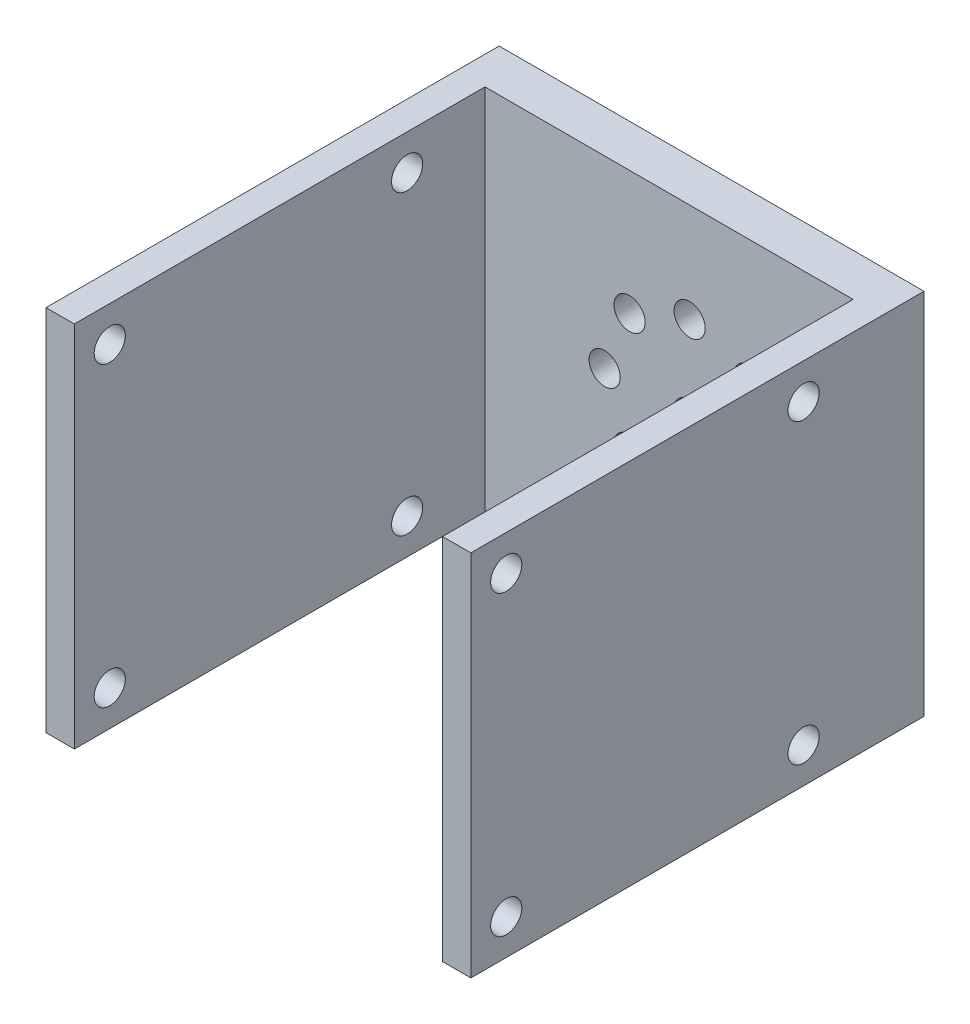
ISO-10303-21;
HEADER;
FILE_DESCRIPTION(('STEP AP214'),'2;1');
FILE_NAME('part.step','',(''),(''),'','','');
FILE_SCHEMA(('AUTOMOTIVE_DESIGN { 1 0 10303 214 1 1 1 1 }'));
ENDSEC;
DATA;
#1=APPLICATION_CONTEXT('core data for automotive mechanical design processes');
#2=APPLICATION_PROTOCOL_DEFINITION('international standard','automotive_design',2000,#1);
#3=PRODUCT_CONTEXT('',#1,'mechanical');
#4=PRODUCT('Part','Part','',(#3));
#5=PRODUCT_RELATED_PRODUCT_CATEGORY('part','',(#4));
#6=PRODUCT_DEFINITION_FORMATION('','',#4);
#7=PRODUCT_DEFINITION_CONTEXT('part definition',#1,'design');
#8=PRODUCT_DEFINITION('design','',#6,#7);
#9=PRODUCT_DEFINITION_SHAPE('','',#8);
#10=(LENGTH_UNIT() NAMED_UNIT(*) SI_UNIT(.MILLI.,.METRE.));
#11=(NAMED_UNIT(*) PLANE_ANGLE_UNIT() SI_UNIT($,.RADIAN.));
#12=(NAMED_UNIT(*) SI_UNIT($,.STERADIAN.) SOLID_ANGLE_UNIT());
#13=UNCERTAINTY_MEASURE_WITH_UNIT(LENGTH_MEASURE(1.E-05),#10,'distance_accuracy_value','');
#14=(GEOMETRIC_REPRESENTATION_CONTEXT(3) GLOBAL_UNCERTAINTY_ASSIGNED_CONTEXT((#13)) GLOBAL_UNIT_ASSIGNED_CONTEXT((#10,
#11,#12)) REPRESENTATION_CONTEXT('',''));
#15=CARTESIAN_POINT('',(0.,0.,0.));
#16=DIRECTION('',(0.,0.,1.));
#17=DIRECTION('',(1.,0.,0.));
#18=AXIS2_PLACEMENT_3D('',#15,#16,#17);
#19=CARTESIAN_POINT('',(0.,0.,3.));
#20=DIRECTION('',(0.,0.,1.));
#21=DIRECTION('',(1.,0.,0.));
#22=AXIS2_PLACEMENT_3D('',#19,#20,#21);
#23=PLANE('',#22);
#24=CARTESIAN_POINT('',(-4.55,0.,3.));
#25=DIRECTION('',(0.,0.,1.));
#26=DIRECTION('',(1.,0.,0.));
#27=AXIS2_PLACEMENT_3D('',#24,#25,#26);
#28=CIRCLE('',#27,1.1);
#29=CARTESIAN_POINT('',(-3.45,0.,3.));
#30=VERTEX_POINT('',#29);
#31=EDGE_CURVE('E179',#30,#30,#28,.T.);
#32=ORIENTED_EDGE('',*,*,#31,.F.);
#33=EDGE_LOOP('',(#32));
#34=FACE_BOUND('',#33,.T.);
#35=CARTESIAN_POINT('',(1.45,-6.,3.));
#36=DIRECTION('',(0.,0.,1.));
#37=DIRECTION('',(1.,0.,0.));
#38=AXIS2_PLACEMENT_3D('',#35,#36,#37);
#39=CIRCLE('',#38,1.1);
#40=CARTESIAN_POINT('',(2.55,-6.,3.));
#41=VERTEX_POINT('',#40);
#42=EDGE_CURVE('E191',#41,#41,#39,.T.);
#43=ORIENTED_EDGE('',*,*,#42,.F.);
#44=EDGE_LOOP('',(#43));
#45=FACE_BOUND('',#44,.T.);
#46=CARTESIAN_POINT('',(7.45,0.,3.));
#47=DIRECTION('',(0.,0.,1.));
#48=DIRECTION('',(1.,0.,0.));
#49=AXIS2_PLACEMENT_3D('',#46,#47,#48);
#50=CIRCLE('',#49,1.1);
#51=CARTESIAN_POINT('',(8.55,0.,3.));
#52=VERTEX_POINT('',#51);
#53=EDGE_CURVE('E203',#52,#52,#50,.T.);
#54=ORIENTED_EDGE('',*,*,#53,.F.);
#55=EDGE_LOOP('',(#54));
#56=FACE_BOUND('',#55,.T.);
#57=CARTESIAN_POINT('',(1.45,6.,3.));
#58=DIRECTION('',(0.,0.,1.));
#59=DIRECTION('',(1.,0.,0.));
#60=AXIS2_PLACEMENT_3D('',#57,#58,#59);
#61=CIRCLE('',#60,1.1);
#62=CARTESIAN_POINT('',(2.55,6.,3.));
#63=VERTEX_POINT('',#62);
#64=EDGE_CURVE('E215',#63,#63,#61,.T.);
#65=ORIENTED_EDGE('',*,*,#64,.F.);
#66=EDGE_LOOP('',(#65));
#67=FACE_BOUND('',#66,.T.);
#68=DIRECTION('',(0.,1.,0.));
#69=VECTOR('',#68,1.);
#70=CARTESIAN_POINT('',(13.,13.,3.));
#71=LINE('',#70,#69);
#72=CARTESIAN_POINT('',(13.,-13.,3.));
#73=VERTEX_POINT('',#72);
#74=CARTESIAN_POINT('',(13.,13.,3.));
#75=VERTEX_POINT('',#74);
#76=EDGE_CURVE('E227',#73,#75,#71,.T.);
#77=ORIENTED_EDGE('',*,*,#76,.T.);
#78=DIRECTION('',(-1.,0.,0.));
#79=VECTOR('',#78,1.);
#80=CARTESIAN_POINT('',(-13.,13.,3.));
#81=LINE('',#80,#79);
#82=CARTESIAN_POINT('',(-13.,13.,3.));
#83=VERTEX_POINT('',#82);
#84=EDGE_CURVE('E230',#75,#83,#81,.T.);
#85=ORIENTED_EDGE('',*,*,#84,.T.);
#86=DIRECTION('',(0.,-1.,0.));
#87=VECTOR('',#86,1.);
#88=CARTESIAN_POINT('',(-13.,13.,3.));
#89=LINE('',#88,#87);
#90=CARTESIAN_POINT('',(-13.,-13.,3.));
#91=VERTEX_POINT('',#90);
#92=EDGE_CURVE('E42',#83,#91,#89,.T.);
#93=ORIENTED_EDGE('',*,*,#92,.T.);
#94=DIRECTION('',(1.,0.,0.));
#95=VECTOR('',#94,1.);
#96=CARTESIAN_POINT('',(-13.,-13.,3.));
#97=LINE('',#96,#95);
#98=EDGE_CURVE('E11',#91,#73,#97,.T.);
#99=ORIENTED_EDGE('',*,*,#98,.T.);
#100=EDGE_LOOP('',(#77,#85,#93,#99));
#101=FACE_BOUND('',#100,.T.);
#102=CARTESIAN_POINT('',(1.45,0.,3.));
#103=DIRECTION('',(0.,0.,1.));
#104=DIRECTION('',(1.,0.,0.));
#105=AXIS2_PLACEMENT_3D('',#102,#103,#104);
#106=CIRCLE('',#105,1.1);
#107=CARTESIAN_POINT('',(2.55,0.,3.));
#108=VERTEX_POINT('',#107);
#109=EDGE_CURVE('E221',#108,#108,#106,.T.);
#110=ORIENTED_EDGE('',*,*,#109,.F.);
#111=EDGE_LOOP('',(#110));
#112=FACE_BOUND('',#111,.T.);
#113=CARTESIAN_POINT('',(5.69264068711928,4.24264068711929,3.));
#114=DIRECTION('',(0.,0.,1.));
#115=DIRECTION('',(1.,0.,0.));
#116=AXIS2_PLACEMENT_3D('',#113,#114,#115);
#117=CIRCLE('',#116,1.1);
#118=CARTESIAN_POINT('',(6.79264068711929,4.24264068711929,3.));
#119=VERTEX_POINT('',#118);
#120=EDGE_CURVE('E209',#119,#119,#117,.T.);
#121=ORIENTED_EDGE('',*,*,#120,.F.);
#122=EDGE_LOOP('',(#121));
#123=FACE_BOUND('',#122,.T.);
#124=CARTESIAN_POINT('',(5.69264068711928,-4.24264068711928,3.));
#125=DIRECTION('',(0.,0.,1.));
#126=DIRECTION('',(1.,0.,0.));
#127=AXIS2_PLACEMENT_3D('',#124,#125,#126);
#128=CIRCLE('',#127,1.1);
#129=CARTESIAN_POINT('',(6.79264068711929,-4.24264068711928,3.));
#130=VERTEX_POINT('',#129);
#131=EDGE_CURVE('E197',#130,#130,#128,.T.);
#132=ORIENTED_EDGE('',*,*,#131,.F.);
#133=EDGE_LOOP('',(#132));
#134=FACE_BOUND('',#133,.T.);
#135=CARTESIAN_POINT('',(-2.79264068711929,-4.24264068711929,3.));
#136=DIRECTION('',(0.,0.,1.));
#137=DIRECTION('',(1.,0.,0.));
#138=AXIS2_PLACEMENT_3D('',#135,#136,#137);
#139=CIRCLE('',#138,1.1);
#140=CARTESIAN_POINT('',(-1.69264068711929,-4.24264068711929,3.));
#141=VERTEX_POINT('',#140);
#142=EDGE_CURVE('E185',#141,#141,#139,.T.);
#143=ORIENTED_EDGE('',*,*,#142,.F.);
#144=EDGE_LOOP('',(#143));
#145=FACE_BOUND('',#144,.T.);
#146=CARTESIAN_POINT('',(-2.79264068711929,4.24264068711928,3.));
#147=DIRECTION('',(0.,0.,1.));
#148=DIRECTION('',(1.,0.,0.));
#149=AXIS2_PLACEMENT_3D('',#146,#147,#148);
#150=CIRCLE('',#149,1.1);
#151=CARTESIAN_POINT('',(-1.69264068711929,4.24264068711928,3.));
#152=VERTEX_POINT('',#151);
#153=EDGE_CURVE('E173',#152,#152,#150,.T.);
#154=ORIENTED_EDGE('',*,*,#153,.F.);
#155=EDGE_LOOP('',(#154));
#156=FACE_BOUND('',#155,.T.);
#157=ADVANCED_FACE('F33',(#34,#45,#56,#67,#101,#112,#123,#134,#145,#156),#23,.T.);
#158=CARTESIAN_POINT('',(0.,0.,0.));
#159=DIRECTION('',(0.,0.,1.));
#160=DIRECTION('',(1.,0.,0.));
#161=AXIS2_PLACEMENT_3D('',#158,#159,#160);
#162=PLANE('',#161);
#163=DIRECTION('',(-1.,0.,0.));
#164=VECTOR('',#163,1.);
#165=CARTESIAN_POINT('',(-13.,13.,0.));
#166=LINE('',#165,#164);
#167=CARTESIAN_POINT('',(15.,13.,0.));
#168=VERTEX_POINT('',#167);
#169=CARTESIAN_POINT('',(-15.,13.,0.));
#170=VERTEX_POINT('',#169);
#171=EDGE_CURVE('E224',#168,#170,#166,.T.);
#172=ORIENTED_EDGE('',*,*,#171,.F.);
#173=DIRECTION('',(0.,1.,0.));
#174=VECTOR('',#173,1.);
#175=CARTESIAN_POINT('',(15.,-13.,0.));
#176=LINE('',#175,#174);
#177=CARTESIAN_POINT('',(15.,-13.,0.));
#178=VERTEX_POINT('',#177);
#179=EDGE_CURVE('E118',#178,#168,#176,.T.);
#180=ORIENTED_EDGE('',*,*,#179,.F.);
#181=DIRECTION('',(1.,0.,0.));
#182=VECTOR('',#181,1.);
#183=CARTESIAN_POINT('',(-13.,-13.,0.));
#184=LINE('',#183,#182);
#185=CARTESIAN_POINT('',(-15.,-13.,0.));
#186=VERTEX_POINT('',#185);
#187=EDGE_CURVE('E37',#186,#178,#184,.T.);
#188=ORIENTED_EDGE('',*,*,#187,.F.);
#189=DIRECTION('',(0.,-1.,0.));
#190=VECTOR('',#189,1.);
#191=CARTESIAN_POINT('',(-15.,13.,0.));
#192=LINE('',#191,#190);
#193=EDGE_CURVE('E150',#170,#186,#192,.T.);
#194=ORIENTED_EDGE('',*,*,#193,.F.);
#195=EDGE_LOOP('',(#172,#180,#188,#194));
#196=FACE_BOUND('',#195,.T.);
#197=CARTESIAN_POINT('',(1.45,0.,0.));
#198=DIRECTION('',(0.,0.,1.));
#199=DIRECTION('',(1.,0.,0.));
#200=AXIS2_PLACEMENT_3D('',#197,#198,#199);
#201=CIRCLE('',#200,1.1);
#202=CARTESIAN_POINT('',(2.55,0.,0.));
#203=VERTEX_POINT('',#202);
#204=EDGE_CURVE('E218',#203,#203,#201,.T.);
#205=ORIENTED_EDGE('',*,*,#204,.T.);
#206=EDGE_LOOP('',(#205));
#207=FACE_BOUND('',#206,.T.);
#208=CARTESIAN_POINT('',(1.45,6.,0.));
#209=DIRECTION('',(0.,0.,1.));
#210=DIRECTION('',(1.,0.,0.));
#211=AXIS2_PLACEMENT_3D('',#208,#209,#210);
#212=CIRCLE('',#211,1.1);
#213=CARTESIAN_POINT('',(2.55,6.,0.));
#214=VERTEX_POINT('',#213);
#215=EDGE_CURVE('E212',#214,#214,#212,.T.);
#216=ORIENTED_EDGE('',*,*,#215,.T.);
#217=EDGE_LOOP('',(#216));
#218=FACE_BOUND('',#217,.T.);
#219=CARTESIAN_POINT('',(5.69264068711928,4.24264068711929,0.));
#220=DIRECTION('',(0.,0.,1.));
#221=DIRECTION('',(1.,0.,0.));
#222=AXIS2_PLACEMENT_3D('',#219,#220,#221);
#223=CIRCLE('',#222,1.1);
#224=CARTESIAN_POINT('',(6.79264068711929,4.24264068711929,0.));
#225=VERTEX_POINT('',#224);
#226=EDGE_CURVE('E206',#225,#225,#223,.T.);
#227=ORIENTED_EDGE('',*,*,#226,.T.);
#228=EDGE_LOOP('',(#227));
#229=FACE_BOUND('',#228,.T.);
#230=CARTESIAN_POINT('',(7.45,0.,0.));
#231=DIRECTION('',(0.,0.,1.));
#232=DIRECTION('',(1.,0.,0.));
#233=AXIS2_PLACEMENT_3D('',#230,#231,#232);
#234=CIRCLE('',#233,1.1);
#235=CARTESIAN_POINT('',(8.55,0.,0.));
#236=VERTEX_POINT('',#235);
#237=EDGE_CURVE('E200',#236,#236,#234,.T.);
#238=ORIENTED_EDGE('',*,*,#237,.T.);
#239=EDGE_LOOP('',(#238));
#240=FACE_BOUND('',#239,.T.);
#241=CARTESIAN_POINT('',(5.69264068711928,-4.24264068711928,0.));
#242=DIRECTION('',(0.,0.,1.));
#243=DIRECTION('',(1.,0.,0.));
#244=AXIS2_PLACEMENT_3D('',#241,#242,#243);
#245=CIRCLE('',#244,1.1);
#246=CARTESIAN_POINT('',(6.79264068711929,-4.24264068711928,0.));
#247=VERTEX_POINT('',#246);
#248=EDGE_CURVE('E194',#247,#247,#245,.T.);
#249=ORIENTED_EDGE('',*,*,#248,.T.);
#250=EDGE_LOOP('',(#249));
#251=FACE_BOUND('',#250,.T.);
#252=CARTESIAN_POINT('',(1.45,-6.,0.));
#253=DIRECTION('',(0.,0.,1.));
#254=DIRECTION('',(1.,0.,0.));
#255=AXIS2_PLACEMENT_3D('',#252,#253,#254);
#256=CIRCLE('',#255,1.1);
#257=CARTESIAN_POINT('',(2.55,-6.,0.));
#258=VERTEX_POINT('',#257);
#259=EDGE_CURVE('E188',#258,#258,#256,.T.);
#260=ORIENTED_EDGE('',*,*,#259,.T.);
#261=EDGE_LOOP('',(#260));
#262=FACE_BOUND('',#261,.T.);
#263=CARTESIAN_POINT('',(-2.79264068711929,-4.24264068711929,0.));
#264=DIRECTION('',(0.,0.,1.));
#265=DIRECTION('',(1.,0.,0.));
#266=AXIS2_PLACEMENT_3D('',#263,#264,#265);
#267=CIRCLE('',#266,1.1);
#268=CARTESIAN_POINT('',(-1.69264068711929,-4.24264068711929,0.));
#269=VERTEX_POINT('',#268);
#270=EDGE_CURVE('E182',#269,#269,#267,.T.);
#271=ORIENTED_EDGE('',*,*,#270,.T.);
#272=EDGE_LOOP('',(#271));
#273=FACE_BOUND('',#272,.T.);
#274=CARTESIAN_POINT('',(-4.55,0.,0.));
#275=DIRECTION('',(0.,0.,1.));
#276=DIRECTION('',(1.,0.,0.));
#277=AXIS2_PLACEMENT_3D('',#274,#275,#276);
#278=CIRCLE('',#277,1.1);
#279=CARTESIAN_POINT('',(-3.45,0.,0.));
#280=VERTEX_POINT('',#279);
#281=EDGE_CURVE('E176',#280,#280,#278,.T.);
#282=ORIENTED_EDGE('',*,*,#281,.T.);
#283=EDGE_LOOP('',(#282));
#284=FACE_BOUND('',#283,.T.);
#285=CARTESIAN_POINT('',(-2.79264068711929,4.24264068711928,0.));
#286=DIRECTION('',(0.,0.,1.));
#287=DIRECTION('',(1.,0.,0.));
#288=AXIS2_PLACEMENT_3D('',#285,#286,#287);
#289=CIRCLE('',#288,1.1);
#290=CARTESIAN_POINT('',(-1.69264068711929,4.24264068711928,0.));
#291=VERTEX_POINT('',#290);
#292=EDGE_CURVE('E172',#291,#291,#289,.T.);
#293=ORIENTED_EDGE('',*,*,#292,.T.);
#294=EDGE_LOOP('',(#293));
#295=FACE_BOUND('',#294,.T.);
#296=ADVANCED_FACE('F241',(#196,#207,#218,#229,#240,#251,#262,#273,#284,#295),#162,.F.);
#297=CARTESIAN_POINT('',(-13.,13.,3.));
#298=DIRECTION('',(0.,-1.,0.));
#299=DIRECTION('',(0.,0.,-1.));
#300=AXIS2_PLACEMENT_3D('',#297,#298,#299);
#301=PLANE('',#300);
#302=ORIENTED_EDGE('',*,*,#171,.T.);
#303=DIRECTION('',(0.,0.,-1.));
#304=VECTOR('',#303,1.);
#305=CARTESIAN_POINT('',(-15.,13.,0.));
#306=LINE('',#305,#304);
#307=CARTESIAN_POINT('',(-15.,13.,32.));
#308=VERTEX_POINT('',#307);
#309=EDGE_CURVE('E158',#308,#170,#306,.T.);
#310=ORIENTED_EDGE('',*,*,#309,.F.);
#311=DIRECTION('',(1.,0.,0.));
#312=VECTOR('',#311,1.);
#313=CARTESIAN_POINT('',(-15.,13.,32.));
#314=LINE('',#313,#312);
#315=CARTESIAN_POINT('',(-13.,13.,32.));
#316=VERTEX_POINT('',#315);
#317=EDGE_CURVE('E161',#308,#316,#314,.T.);
#318=ORIENTED_EDGE('',*,*,#317,.T.);
#319=DIRECTION('',(0.,0.,-1.));
#320=VECTOR('',#319,1.);
#321=CARTESIAN_POINT('',(-13.,13.,0.));
#322=LINE('',#321,#320);
#323=EDGE_CURVE('E154',#316,#83,#322,.T.);
#324=ORIENTED_EDGE('',*,*,#323,.T.);
#325=ORIENTED_EDGE('',*,*,#84,.F.);
#326=DIRECTION('',(0.,0.,1.));
#327=VECTOR('',#326,1.);
#328=CARTESIAN_POINT('',(13.,13.,0.));
#329=LINE('',#328,#327);
#330=CARTESIAN_POINT('',(13.,13.,32.));
#331=VERTEX_POINT('',#330);
#332=EDGE_CURVE('E58',#75,#331,#329,.T.);
#333=ORIENTED_EDGE('',*,*,#332,.T.);
#334=DIRECTION('',(-1.,0.,0.));
#335=VECTOR('',#334,1.);
#336=CARTESIAN_POINT('',(15.,13.,32.));
#337=LINE('',#336,#335);
#338=CARTESIAN_POINT('',(15.,13.,32.));
#339=VERTEX_POINT('',#338);
#340=EDGE_CURVE('E104',#339,#331,#337,.T.);
#341=ORIENTED_EDGE('',*,*,#340,.F.);
#342=DIRECTION('',(0.,0.,1.));
#343=VECTOR('',#342,1.);
#344=CARTESIAN_POINT('',(15.,13.,0.));
#345=LINE('',#344,#343);
#346=EDGE_CURVE('E111',#168,#339,#345,.T.);
#347=ORIENTED_EDGE('',*,*,#346,.F.);
#348=EDGE_LOOP('',(#302,#310,#318,#324,#325,#333,#341,#347));
#349=FACE_BOUND('',#348,.T.);
#350=ADVANCED_FACE('F35',(#349),#301,.F.);
#351=CARTESIAN_POINT('',(-13.,-13.,3.));
#352=DIRECTION('',(0.,1.,0.));
#353=DIRECTION('',(0.,0.,1.));
#354=AXIS2_PLACEMENT_3D('',#351,#352,#353);
#355=PLANE('',#354);
#356=ORIENTED_EDGE('',*,*,#187,.T.);
#357=DIRECTION('',(0.,0.,-1.));
#358=VECTOR('',#357,1.);
#359=CARTESIAN_POINT('',(15.,-13.,32.));
#360=LINE('',#359,#358);
#361=CARTESIAN_POINT('',(15.,-13.,32.));
#362=VERTEX_POINT('',#361);
#363=EDGE_CURVE('E110',#362,#178,#360,.T.);
#364=ORIENTED_EDGE('',*,*,#363,.F.);
#365=DIRECTION('',(-1.,0.,0.));
#366=VECTOR('',#365,1.);
#367=CARTESIAN_POINT('',(15.,-13.,32.));
#368=LINE('',#367,#366);
#369=CARTESIAN_POINT('',(13.,-13.,32.));
#370=VERTEX_POINT('',#369);
#371=EDGE_CURVE('E106',#362,#370,#368,.T.);
#372=ORIENTED_EDGE('',*,*,#371,.T.);
#373=DIRECTION('',(0.,0.,-1.));
#374=VECTOR('',#373,1.);
#375=CARTESIAN_POINT('',(13.,-13.,32.));
#376=LINE('',#375,#374);
#377=EDGE_CURVE('E120',#370,#73,#376,.T.);
#378=ORIENTED_EDGE('',*,*,#377,.T.);
#379=ORIENTED_EDGE('',*,*,#98,.F.);
#380=DIRECTION('',(0.,0.,1.));
#381=VECTOR('',#380,1.);
#382=CARTESIAN_POINT('',(-13.,-13.,0.));
#383=LINE('',#382,#381);
#384=CARTESIAN_POINT('',(-13.,-13.,32.));
#385=VERTEX_POINT('',#384);
#386=EDGE_CURVE('E50',#91,#385,#383,.T.);
#387=ORIENTED_EDGE('',*,*,#386,.T.);
#388=DIRECTION('',(1.,0.,0.));
#389=VECTOR('',#388,1.);
#390=CARTESIAN_POINT('',(-15.,-13.,32.));
#391=LINE('',#390,#389);
#392=CARTESIAN_POINT('',(-15.,-13.,32.));
#393=VERTEX_POINT('',#392);
#394=EDGE_CURVE('E169',#393,#385,#391,.T.);
#395=ORIENTED_EDGE('',*,*,#394,.F.);
#396=DIRECTION('',(0.,0.,1.));
#397=VECTOR('',#396,1.);
#398=CARTESIAN_POINT('',(-15.,-13.,0.));
#399=LINE('',#398,#397);
#400=EDGE_CURVE('E153',#186,#393,#399,.T.);
#401=ORIENTED_EDGE('',*,*,#400,.F.);
#402=EDGE_LOOP('',(#356,#364,#372,#378,#379,#387,#395,#401));
#403=FACE_BOUND('',#402,.T.);
#404=ADVANCED_FACE('F236',(#403),#355,.F.);
#405=CARTESIAN_POINT('',(1.45,0.,3.));
#406=DIRECTION('',(0.,0.,-1.));
#407=DIRECTION('',(-1.,0.,0.));
#408=AXIS2_PLACEMENT_3D('',#405,#406,#407);
#409=CYLINDRICAL_SURFACE('',#408,1.1);
#410=ORIENTED_EDGE('',*,*,#109,.T.);
#411=EDGE_LOOP('',(#410));
#412=FACE_BOUND('',#411,.T.);
#413=ORIENTED_EDGE('',*,*,#204,.F.);
#414=EDGE_LOOP('',(#413));
#415=FACE_BOUND('',#414,.T.);
#416=ADVANCED_FACE('F295',(#412,#415),#409,.F.);
#417=CARTESIAN_POINT('',(1.45,6.,3.));
#418=DIRECTION('',(0.,0.,-1.));
#419=DIRECTION('',(-1.,0.,0.));
#420=AXIS2_PLACEMENT_3D('',#417,#418,#419);
#421=CYLINDRICAL_SURFACE('',#420,1.1);
#422=ORIENTED_EDGE('',*,*,#64,.T.);
#423=EDGE_LOOP('',(#422));
#424=FACE_BOUND('',#423,.T.);
#425=ORIENTED_EDGE('',*,*,#215,.F.);
#426=EDGE_LOOP('',(#425));
#427=FACE_BOUND('',#426,.T.);
#428=ADVANCED_FACE('F302',(#424,#427),#421,.F.);
#429=CARTESIAN_POINT('',(5.69264068711928,4.24264068711929,3.));
#430=DIRECTION('',(0.,0.,-1.));
#431=DIRECTION('',(-1.,0.,0.));
#432=AXIS2_PLACEMENT_3D('',#429,#430,#431);
#433=CYLINDRICAL_SURFACE('',#432,1.1);
#434=ORIENTED_EDGE('',*,*,#120,.T.);
#435=EDGE_LOOP('',(#434));
#436=FACE_BOUND('',#435,.T.);
#437=ORIENTED_EDGE('',*,*,#226,.F.);
#438=EDGE_LOOP('',(#437));
#439=FACE_BOUND('',#438,.T.);
#440=ADVANCED_FACE('F427',(#436,#439),#433,.F.);
#441=CARTESIAN_POINT('',(7.45,0.,3.));
#442=DIRECTION('',(0.,0.,-1.));
#443=DIRECTION('',(-1.,0.,0.));
#444=AXIS2_PLACEMENT_3D('',#441,#442,#443);
#445=CYLINDRICAL_SURFACE('',#444,1.1);
#446=ORIENTED_EDGE('',*,*,#53,.T.);
#447=EDGE_LOOP('',(#446));
#448=FACE_BOUND('',#447,.T.);
#449=ORIENTED_EDGE('',*,*,#237,.F.);
#450=EDGE_LOOP('',(#449));
#451=FACE_BOUND('',#450,.T.);
#452=ADVANCED_FACE('F417',(#448,#451),#445,.F.);
#453=CARTESIAN_POINT('',(5.69264068711928,-4.24264068711928,3.));
#454=DIRECTION('',(0.,0.,-1.));
#455=DIRECTION('',(-1.,0.,0.));
#456=AXIS2_PLACEMENT_3D('',#453,#454,#455);
#457=CYLINDRICAL_SURFACE('',#456,1.1);
#458=ORIENTED_EDGE('',*,*,#131,.T.);
#459=EDGE_LOOP('',(#458));
#460=FACE_BOUND('',#459,.T.);
#461=ORIENTED_EDGE('',*,*,#248,.F.);
#462=EDGE_LOOP('',(#461));
#463=FACE_BOUND('',#462,.T.);
#464=ADVANCED_FACE('F407',(#460,#463),#457,.F.);
#465=CARTESIAN_POINT('',(1.45,-6.,3.));
#466=DIRECTION('',(0.,0.,-1.));
#467=DIRECTION('',(-1.,0.,0.));
#468=AXIS2_PLACEMENT_3D('',#465,#466,#467);
#469=CYLINDRICAL_SURFACE('',#468,1.1);
#470=ORIENTED_EDGE('',*,*,#42,.T.);
#471=EDGE_LOOP('',(#470));
#472=FACE_BOUND('',#471,.T.);
#473=ORIENTED_EDGE('',*,*,#259,.F.);
#474=EDGE_LOOP('',(#473));
#475=FACE_BOUND('',#474,.T.);
#476=ADVANCED_FACE('F397',(#472,#475),#469,.F.);
#477=CARTESIAN_POINT('',(-2.79264068711929,-4.24264068711929,3.));
#478=DIRECTION('',(0.,0.,-1.));
#479=DIRECTION('',(-1.,0.,0.));
#480=AXIS2_PLACEMENT_3D('',#477,#478,#479);
#481=CYLINDRICAL_SURFACE('',#480,1.1);
#482=ORIENTED_EDGE('',*,*,#142,.T.);
#483=EDGE_LOOP('',(#482));
#484=FACE_BOUND('',#483,.T.);
#485=ORIENTED_EDGE('',*,*,#270,.F.);
#486=EDGE_LOOP('',(#485));
#487=FACE_BOUND('',#486,.T.);
#488=ADVANCED_FACE('F387',(#484,#487),#481,.F.);
#489=CARTESIAN_POINT('',(-4.55,0.,3.));
#490=DIRECTION('',(0.,0.,-1.));
#491=DIRECTION('',(-1.,0.,0.));
#492=AXIS2_PLACEMENT_3D('',#489,#490,#491);
#493=CYLINDRICAL_SURFACE('',#492,1.1);
#494=ORIENTED_EDGE('',*,*,#31,.T.);
#495=EDGE_LOOP('',(#494));
#496=FACE_BOUND('',#495,.T.);
#497=ORIENTED_EDGE('',*,*,#281,.F.);
#498=EDGE_LOOP('',(#497));
#499=FACE_BOUND('',#498,.T.);
#500=ADVANCED_FACE('F377',(#496,#499),#493,.F.);
#501=CARTESIAN_POINT('',(-2.79264068711929,4.24264068711928,3.));
#502=DIRECTION('',(0.,0.,-1.));
#503=DIRECTION('',(-1.,0.,0.));
#504=AXIS2_PLACEMENT_3D('',#501,#502,#503);
#505=CYLINDRICAL_SURFACE('',#504,1.1);
#506=ORIENTED_EDGE('',*,*,#153,.T.);
#507=EDGE_LOOP('',(#506));
#508=FACE_BOUND('',#507,.T.);
#509=ORIENTED_EDGE('',*,*,#292,.F.);
#510=EDGE_LOOP('',(#509));
#511=FACE_BOUND('',#510,.T.);
#512=ADVANCED_FACE('F264',(#508,#511),#505,.F.);
#513=CARTESIAN_POINT('',(-15.,0.,0.));
#514=DIRECTION('',(-1.,0.,0.));
#515=DIRECTION('',(0.,0.,1.));
#516=AXIS2_PLACEMENT_3D('',#513,#514,#515);
#517=PLANE('',#516);
#518=CARTESIAN_POINT('',(-15.,10.5,29.5));
#519=DIRECTION('',(-1.,0.,0.));
#520=DIRECTION('',(0.,0.,1.));
#521=AXIS2_PLACEMENT_3D('',#518,#519,#520);
#522=CIRCLE('',#521,1.1);
#523=CARTESIAN_POINT('',(-15.,10.5,30.6));
#524=VERTEX_POINT('',#523);
#525=EDGE_CURVE('E133',#524,#524,#522,.T.);
#526=ORIENTED_EDGE('',*,*,#525,.F.);
#527=EDGE_LOOP('',(#526));
#528=FACE_BOUND('',#527,.T.);
#529=CARTESIAN_POINT('',(-15.,10.5,8.49999999999999));
#530=DIRECTION('',(-1.,0.,0.));
#531=DIRECTION('',(0.,0.,1.));
#532=AXIS2_PLACEMENT_3D('',#529,#530,#531);
#533=CIRCLE('',#532,1.1);
#534=CARTESIAN_POINT('',(-15.,10.5,9.59999999999999));
#535=VERTEX_POINT('',#534);
#536=EDGE_CURVE('E145',#535,#535,#533,.T.);
#537=ORIENTED_EDGE('',*,*,#536,.F.);
#538=EDGE_LOOP('',(#537));
#539=FACE_BOUND('',#538,.T.);
#540=ORIENTED_EDGE('',*,*,#193,.T.);
#541=ORIENTED_EDGE('',*,*,#400,.T.);
#542=DIRECTION('',(0.,1.,0.));
#543=VECTOR('',#542,1.);
#544=CARTESIAN_POINT('',(-15.,13.,32.));
#545=LINE('',#544,#543);
#546=EDGE_CURVE('E156',#393,#308,#545,.T.);
#547=ORIENTED_EDGE('',*,*,#546,.T.);
#548=ORIENTED_EDGE('',*,*,#309,.T.);
#549=EDGE_LOOP('',(#540,#541,#547,#548));
#550=FACE_BOUND('',#549,.T.);
#551=CARTESIAN_POINT('',(-15.,-10.5,8.49999999999999));
#552=DIRECTION('',(-1.,0.,0.));
#553=DIRECTION('',(0.,0.,1.));
#554=AXIS2_PLACEMENT_3D('',#551,#552,#553);
#555=CIRCLE('',#554,1.1);
#556=CARTESIAN_POINT('',(-15.,-10.5,9.59999999999999));
#557=VERTEX_POINT('',#556);
#558=EDGE_CURVE('E139',#557,#557,#555,.T.);
#559=ORIENTED_EDGE('',*,*,#558,.F.);
#560=EDGE_LOOP('',(#559));
#561=FACE_BOUND('',#560,.T.);
#562=CARTESIAN_POINT('',(-15.,-10.5,29.5));
#563=DIRECTION('',(-1.,0.,0.));
#564=DIRECTION('',(0.,0.,1.));
#565=AXIS2_PLACEMENT_3D('',#562,#563,#564);
#566=CIRCLE('',#565,1.1);
#567=CARTESIAN_POINT('',(-15.,-10.5,30.6));
#568=VERTEX_POINT('',#567);
#569=EDGE_CURVE('E125',#568,#568,#566,.T.);
#570=ORIENTED_EDGE('',*,*,#569,.F.);
#571=EDGE_LOOP('',(#570));
#572=FACE_BOUND('',#571,.T.);
#573=ADVANCED_FACE('F261',(#528,#539,#550,#561,#572),#517,.T.);
#574=CARTESIAN_POINT('',(-13.,0.,0.));
#575=DIRECTION('',(-1.,0.,0.));
#576=DIRECTION('',(0.,0.,1.));
#577=AXIS2_PLACEMENT_3D('',#574,#575,#576);
#578=PLANE('',#577);
#579=ORIENTED_EDGE('',*,*,#92,.F.);
#580=ORIENTED_EDGE('',*,*,#323,.F.);
#581=DIRECTION('',(0.,1.,0.));
#582=VECTOR('',#581,1.);
#583=CARTESIAN_POINT('',(-13.,13.,32.));
#584=LINE('',#583,#582);
#585=EDGE_CURVE('E163',#385,#316,#584,.T.);
#586=ORIENTED_EDGE('',*,*,#585,.F.);
#587=ORIENTED_EDGE('',*,*,#386,.F.);
#588=EDGE_LOOP('',(#579,#580,#586,#587));
#589=FACE_BOUND('',#588,.T.);
#590=CARTESIAN_POINT('',(-13.,10.5,8.49999999999999));
#591=DIRECTION('',(-1.,0.,0.));
#592=DIRECTION('',(0.,0.,1.));
#593=AXIS2_PLACEMENT_3D('',#590,#591,#592);
#594=CIRCLE('',#593,1.1);
#595=CARTESIAN_POINT('',(-13.,10.5,9.59999999999999));
#596=VERTEX_POINT('',#595);
#597=EDGE_CURVE('E142',#596,#596,#594,.T.);
#598=ORIENTED_EDGE('',*,*,#597,.T.);
#599=EDGE_LOOP('',(#598));
#600=FACE_BOUND('',#599,.T.);
#601=CARTESIAN_POINT('',(-13.,-10.5,8.49999999999999));
#602=DIRECTION('',(-1.,0.,0.));
#603=DIRECTION('',(0.,0.,1.));
#604=AXIS2_PLACEMENT_3D('',#601,#602,#603);
#605=CIRCLE('',#604,1.1);
#606=CARTESIAN_POINT('',(-13.,-10.5,9.59999999999999));
#607=VERTEX_POINT('',#606);
#608=EDGE_CURVE('E136',#607,#607,#605,.T.);
#609=ORIENTED_EDGE('',*,*,#608,.T.);
#610=EDGE_LOOP('',(#609));
#611=FACE_BOUND('',#610,.T.);
#612=CARTESIAN_POINT('',(-13.,10.5,29.5));
#613=DIRECTION('',(-1.,0.,0.));
#614=DIRECTION('',(0.,0.,1.));
#615=AXIS2_PLACEMENT_3D('',#612,#613,#614);
#616=CIRCLE('',#615,1.1);
#617=CARTESIAN_POINT('',(-13.,10.5,30.6));
#618=VERTEX_POINT('',#617);
#619=EDGE_CURVE('E131',#618,#618,#616,.T.);
#620=ORIENTED_EDGE('',*,*,#619,.T.);
#621=EDGE_LOOP('',(#620));
#622=FACE_BOUND('',#621,.T.);
#623=CARTESIAN_POINT('',(-13.,-10.5,29.5));
#624=DIRECTION('',(-1.,0.,0.));
#625=DIRECTION('',(0.,0.,1.));
#626=AXIS2_PLACEMENT_3D('',#623,#624,#625);
#627=CIRCLE('',#626,1.1);
#628=CARTESIAN_POINT('',(-13.,-10.5,30.6));
#629=VERTEX_POINT('',#628);
#630=EDGE_CURVE('E122',#629,#629,#627,.T.);
#631=ORIENTED_EDGE('',*,*,#630,.T.);
#632=EDGE_LOOP('',(#631));
#633=FACE_BOUND('',#632,.T.);
#634=ADVANCED_FACE('F254',(#589,#600,#611,#622,#633),#578,.F.);
#635=CARTESIAN_POINT('',(-15.,13.,32.));
#636=DIRECTION('',(0.,0.,-1.));
#637=DIRECTION('',(-1.,0.,0.));
#638=AXIS2_PLACEMENT_3D('',#635,#636,#637);
#639=PLANE('',#638);
#640=ORIENTED_EDGE('',*,*,#585,.T.);
#641=ORIENTED_EDGE('',*,*,#317,.F.);
#642=ORIENTED_EDGE('',*,*,#546,.F.);
#643=ORIENTED_EDGE('',*,*,#394,.T.);
#644=EDGE_LOOP('',(#640,#641,#642,#643));
#645=FACE_BOUND('',#644,.T.);
#646=ADVANCED_FACE('F259',(#645),#639,.F.);
#647=CARTESIAN_POINT('',(-15.,10.5,8.49999999999999));
#648=DIRECTION('',(1.,0.,0.));
#649=DIRECTION('',(0.,0.,-1.));
#650=AXIS2_PLACEMENT_3D('',#647,#648,#649);
#651=CYLINDRICAL_SURFACE('',#650,1.1);
#652=ORIENTED_EDGE('',*,*,#536,.T.);
#653=EDGE_LOOP('',(#652));
#654=FACE_BOUND('',#653,.T.);
#655=ORIENTED_EDGE('',*,*,#597,.F.);
#656=EDGE_LOOP('',(#655));
#657=FACE_BOUND('',#656,.T.);
#658=ADVANCED_FACE('F283',(#654,#657),#651,.F.);
#659=CARTESIAN_POINT('',(-15.,-10.5,8.49999999999999));
#660=DIRECTION('',(1.,0.,0.));
#661=DIRECTION('',(0.,0.,-1.));
#662=AXIS2_PLACEMENT_3D('',#659,#660,#661);
#663=CYLINDRICAL_SURFACE('',#662,1.1);
#664=ORIENTED_EDGE('',*,*,#558,.T.);
#665=EDGE_LOOP('',(#664));
#666=FACE_BOUND('',#665,.T.);
#667=ORIENTED_EDGE('',*,*,#608,.F.);
#668=EDGE_LOOP('',(#667));
#669=FACE_BOUND('',#668,.T.);
#670=ADVANCED_FACE('F332',(#666,#669),#663,.F.);
#671=CARTESIAN_POINT('',(-15.,10.5,29.5));
#672=DIRECTION('',(1.,0.,0.));
#673=DIRECTION('',(0.,0.,-1.));
#674=AXIS2_PLACEMENT_3D('',#671,#672,#673);
#675=CYLINDRICAL_SURFACE('',#674,1.1);
#676=ORIENTED_EDGE('',*,*,#525,.T.);
#677=EDGE_LOOP('',(#676));
#678=FACE_BOUND('',#677,.T.);
#679=ORIENTED_EDGE('',*,*,#619,.F.);
#680=EDGE_LOOP('',(#679));
#681=FACE_BOUND('',#680,.T.);
#682=ADVANCED_FACE('F274',(#678,#681),#675,.F.);
#683=CARTESIAN_POINT('',(-15.,-10.5,29.5));
#684=DIRECTION('',(1.,0.,0.));
#685=DIRECTION('',(0.,0.,-1.));
#686=AXIS2_PLACEMENT_3D('',#683,#684,#685);
#687=CYLINDRICAL_SURFACE('',#686,1.1);
#688=ORIENTED_EDGE('',*,*,#569,.T.);
#689=EDGE_LOOP('',(#688));
#690=FACE_BOUND('',#689,.T.);
#691=ORIENTED_EDGE('',*,*,#630,.F.);
#692=EDGE_LOOP('',(#691));
#693=FACE_BOUND('',#692,.T.);
#694=ADVANCED_FACE('F271',(#690,#693),#687,.F.);
#695=CARTESIAN_POINT('',(15.,0.,0.));
#696=DIRECTION('',(1.,0.,0.));
#697=DIRECTION('',(0.,0.,-1.));
#698=AXIS2_PLACEMENT_3D('',#695,#696,#697);
#699=PLANE('',#698);
#700=CARTESIAN_POINT('',(15.,10.5,29.5));
#701=DIRECTION('',(1.,0.,0.));
#702=DIRECTION('',(0.,0.,-1.));
#703=AXIS2_PLACEMENT_3D('',#700,#701,#702);
#704=CIRCLE('',#703,1.1);
#705=CARTESIAN_POINT('',(15.,10.5,28.4));
#706=VERTEX_POINT('',#705);
#707=EDGE_CURVE('E553',#706,#706,#704,.T.);
#708=ORIENTED_EDGE('',*,*,#707,.F.);
#709=EDGE_LOOP('',(#708));
#710=FACE_BOUND('',#709,.T.);
#711=CARTESIAN_POINT('',(15.,-10.5,8.49999999999999));
#712=DIRECTION('',(1.,0.,0.));
#713=DIRECTION('',(0.,0.,-1.));
#714=AXIS2_PLACEMENT_3D('',#711,#712,#713);
#715=CIRCLE('',#714,1.1);
#716=CARTESIAN_POINT('',(15.,-10.5,7.39999999999999));
#717=VERTEX_POINT('',#716);
#718=EDGE_CURVE('E247',#717,#717,#715,.T.);
#719=ORIENTED_EDGE('',*,*,#718,.F.);
#720=EDGE_LOOP('',(#719));
#721=FACE_BOUND('',#720,.T.);
#722=ORIENTED_EDGE('',*,*,#346,.T.);
#723=DIRECTION('',(0.,-1.,0.));
#724=VECTOR('',#723,1.);
#725=CARTESIAN_POINT('',(15.,13.,32.));
#726=LINE('',#725,#724);
#727=EDGE_CURVE('E100',#339,#362,#726,.T.);
#728=ORIENTED_EDGE('',*,*,#727,.T.);
#729=ORIENTED_EDGE('',*,*,#363,.T.);
#730=ORIENTED_EDGE('',*,*,#179,.T.);
#731=EDGE_LOOP('',(#722,#728,#729,#730));
#732=FACE_BOUND('',#731,.T.);
#733=CARTESIAN_POINT('',(15.,10.5,8.49999999999999));
#734=DIRECTION('',(1.,0.,0.));
#735=DIRECTION('',(0.,0.,-1.));
#736=AXIS2_PLACEMENT_3D('',#733,#734,#735);
#737=CIRCLE('',#736,1.1);
#738=CARTESIAN_POINT('',(15.,10.5,7.39999999999999));
#739=VERTEX_POINT('',#738);
#740=EDGE_CURVE('E559',#739,#739,#737,.T.);
#741=ORIENTED_EDGE('',*,*,#740,.F.);
#742=EDGE_LOOP('',(#741));
#743=FACE_BOUND('',#742,.T.);
#744=CARTESIAN_POINT('',(15.,-10.5,29.5));
#745=DIRECTION('',(1.,0.,0.));
#746=DIRECTION('',(0.,0.,-1.));
#747=AXIS2_PLACEMENT_3D('',#744,#745,#746);
#748=CIRCLE('',#747,1.1);
#749=CARTESIAN_POINT('',(15.,-10.5,28.4));
#750=VERTEX_POINT('',#749);
#751=EDGE_CURVE('E544',#750,#750,#748,.T.);
#752=ORIENTED_EDGE('',*,*,#751,.F.);
#753=EDGE_LOOP('',(#752));
#754=FACE_BOUND('',#753,.T.);
#755=ADVANCED_FACE('F115',(#710,#721,#732,#743,#754),#699,.T.);
#756=CARTESIAN_POINT('',(13.,0.,0.));
#757=DIRECTION('',(1.,0.,0.));
#758=DIRECTION('',(0.,0.,-1.));
#759=AXIS2_PLACEMENT_3D('',#756,#757,#758);
#760=PLANE('',#759);
#761=ORIENTED_EDGE('',*,*,#76,.F.);
#762=ORIENTED_EDGE('',*,*,#377,.F.);
#763=DIRECTION('',(0.,-1.,0.));
#764=VECTOR('',#763,1.);
#765=CARTESIAN_POINT('',(13.,13.,32.));
#766=LINE('',#765,#764);
#767=EDGE_CURVE('E246',#331,#370,#766,.T.);
#768=ORIENTED_EDGE('',*,*,#767,.F.);
#769=ORIENTED_EDGE('',*,*,#332,.F.);
#770=EDGE_LOOP('',(#761,#762,#768,#769));
#771=FACE_BOUND('',#770,.T.);
#772=CARTESIAN_POINT('',(13.,-10.5,8.49999999999999));
#773=DIRECTION('',(1.,0.,0.));
#774=DIRECTION('',(0.,0.,-1.));
#775=AXIS2_PLACEMENT_3D('',#772,#773,#774);
#776=CIRCLE('',#775,1.1);
#777=CARTESIAN_POINT('',(13.,-10.5,7.39999999999999));
#778=VERTEX_POINT('',#777);
#779=EDGE_CURVE('E562',#778,#778,#776,.T.);
#780=ORIENTED_EDGE('',*,*,#779,.T.);
#781=EDGE_LOOP('',(#780));
#782=FACE_BOUND('',#781,.T.);
#783=CARTESIAN_POINT('',(13.,10.5,8.49999999999999));
#784=DIRECTION('',(1.,0.,0.));
#785=DIRECTION('',(0.,0.,-1.));
#786=AXIS2_PLACEMENT_3D('',#783,#784,#785);
#787=CIRCLE('',#786,1.1);
#788=CARTESIAN_POINT('',(13.,10.5,7.39999999999999));
#789=VERTEX_POINT('',#788);
#790=EDGE_CURVE('E556',#789,#789,#787,.T.);
#791=ORIENTED_EDGE('',*,*,#790,.T.);
#792=EDGE_LOOP('',(#791));
#793=FACE_BOUND('',#792,.T.);
#794=CARTESIAN_POINT('',(13.,10.5,29.5));
#795=DIRECTION('',(1.,0.,0.));
#796=DIRECTION('',(0.,0.,-1.));
#797=AXIS2_PLACEMENT_3D('',#794,#795,#796);
#798=CIRCLE('',#797,1.1);
#799=CARTESIAN_POINT('',(13.,10.5,28.4));
#800=VERTEX_POINT('',#799);
#801=EDGE_CURVE('E550',#800,#800,#798,.T.);
#802=ORIENTED_EDGE('',*,*,#801,.T.);
#803=EDGE_LOOP('',(#802));
#804=FACE_BOUND('',#803,.T.);
#805=CARTESIAN_POINT('',(13.,-10.5,29.5));
#806=DIRECTION('',(1.,0.,0.));
#807=DIRECTION('',(0.,0.,-1.));
#808=AXIS2_PLACEMENT_3D('',#805,#806,#807);
#809=CIRCLE('',#808,1.1);
#810=CARTESIAN_POINT('',(13.,-10.5,28.4));
#811=VERTEX_POINT('',#810);
#812=EDGE_CURVE('E547',#811,#811,#809,.T.);
#813=ORIENTED_EDGE('',*,*,#812,.T.);
#814=EDGE_LOOP('',(#813));
#815=FACE_BOUND('',#814,.T.);
#816=ADVANCED_FACE('F481',(#771,#782,#793,#804,#815),#760,.F.);
#817=CARTESIAN_POINT('',(15.,13.,32.));
#818=DIRECTION('',(0.,0.,-1.));
#819=DIRECTION('',(-1.,0.,0.));
#820=AXIS2_PLACEMENT_3D('',#817,#818,#819);
#821=PLANE('',#820);
#822=ORIENTED_EDGE('',*,*,#767,.T.);
#823=ORIENTED_EDGE('',*,*,#371,.F.);
#824=ORIENTED_EDGE('',*,*,#727,.F.);
#825=ORIENTED_EDGE('',*,*,#340,.T.);
#826=EDGE_LOOP('',(#822,#823,#824,#825));
#827=FACE_BOUND('',#826,.T.);
#828=ADVANCED_FACE('F102',(#827),#821,.F.);
#829=CARTESIAN_POINT('',(15.,-10.5,8.49999999999999));
#830=DIRECTION('',(-1.,0.,0.));
#831=DIRECTION('',(0.,0.,1.));
#832=AXIS2_PLACEMENT_3D('',#829,#830,#831);
#833=CYLINDRICAL_SURFACE('',#832,1.1);
#834=ORIENTED_EDGE('',*,*,#718,.T.);
#835=EDGE_LOOP('',(#834));
#836=FACE_BOUND('',#835,.T.);
#837=ORIENTED_EDGE('',*,*,#779,.F.);
#838=EDGE_LOOP('',(#837));
#839=FACE_BOUND('',#838,.T.);
#840=ADVANCED_FACE('F497',(#836,#839),#833,.F.);
#841=CARTESIAN_POINT('',(15.,10.5,8.49999999999999));
#842=DIRECTION('',(-1.,0.,0.));
#843=DIRECTION('',(0.,0.,1.));
#844=AXIS2_PLACEMENT_3D('',#841,#842,#843);
#845=CYLINDRICAL_SURFACE('',#844,1.1);
#846=ORIENTED_EDGE('',*,*,#740,.T.);
#847=EDGE_LOOP('',(#846));
#848=FACE_BOUND('',#847,.T.);
#849=ORIENTED_EDGE('',*,*,#790,.F.);
#850=EDGE_LOOP('',(#849));
#851=FACE_BOUND('',#850,.T.);
#852=ADVANCED_FACE('F505',(#848,#851),#845,.F.);
#853=CARTESIAN_POINT('',(15.,10.5,29.5));
#854=DIRECTION('',(-1.,0.,0.));
#855=DIRECTION('',(0.,0.,1.));
#856=AXIS2_PLACEMENT_3D('',#853,#854,#855);
#857=CYLINDRICAL_SURFACE('',#856,1.1);
#858=ORIENTED_EDGE('',*,*,#707,.T.);
#859=EDGE_LOOP('',(#858));
#860=FACE_BOUND('',#859,.T.);
#861=ORIENTED_EDGE('',*,*,#801,.F.);
#862=EDGE_LOOP('',(#861));
#863=FACE_BOUND('',#862,.T.);
#864=ADVANCED_FACE('F514',(#860,#863),#857,.F.);
#865=CARTESIAN_POINT('',(15.,-10.5,29.5));
#866=DIRECTION('',(-1.,0.,0.));
#867=DIRECTION('',(0.,0.,1.));
#868=AXIS2_PLACEMENT_3D('',#865,#866,#867);
#869=CYLINDRICAL_SURFACE('',#868,1.1);
#870=ORIENTED_EDGE('',*,*,#751,.T.);
#871=EDGE_LOOP('',(#870));
#872=FACE_BOUND('',#871,.T.);
#873=ORIENTED_EDGE('',*,*,#812,.F.);
#874=EDGE_LOOP('',(#873));
#875=FACE_BOUND('',#874,.T.);
#876=ADVANCED_FACE('F523',(#872,#875),#869,.F.);
#877=CLOSED_SHELL('',(#157,#296,#350,#404,#416,#428,#440,#452,#464,#476,#488,#500,#512,#573,
#634,#646,#658,#670,#682,#694,#755,#816,#828,#840,#852,#864,#876));
#878=MANIFOLD_SOLID_BREP('B2',#877);
#879=ADVANCED_BREP_SHAPE_REPRESENTATION('',(#18,#878),#14);
#880=SHAPE_DEFINITION_REPRESENTATION(#9,#879);
ENDSEC;
END-ISO-10303-21;
